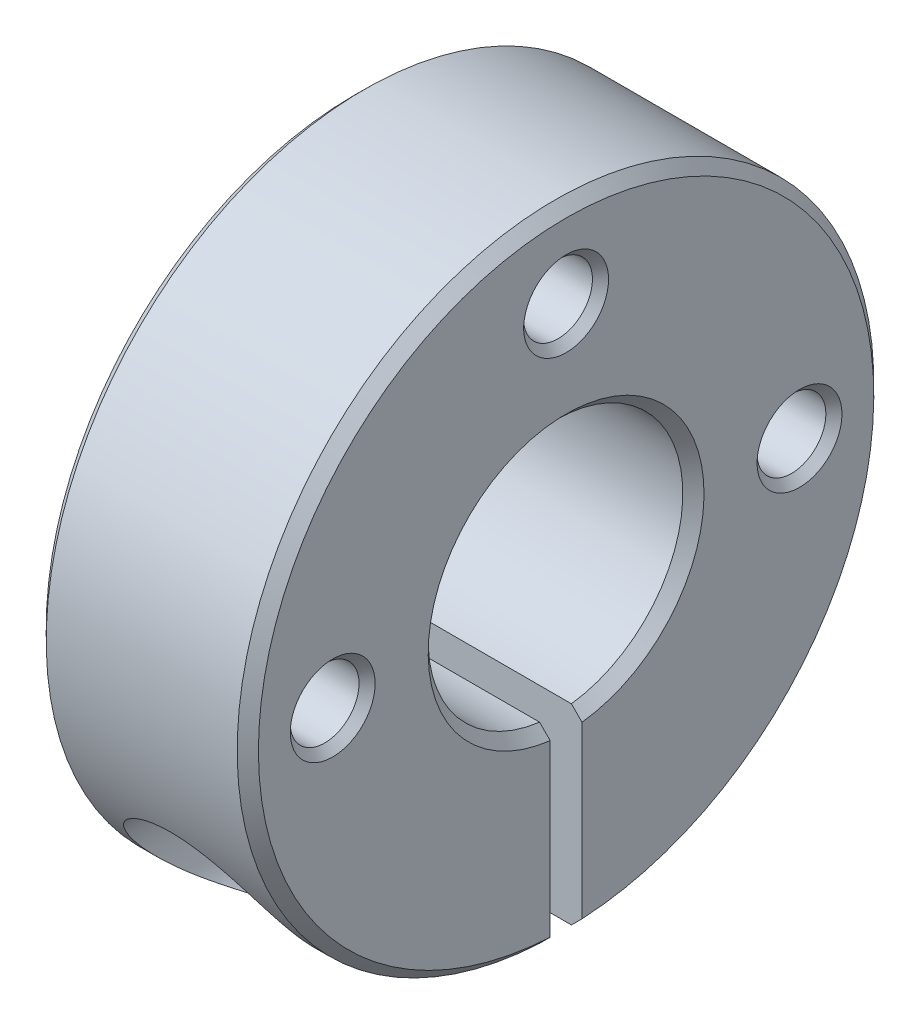
ISO-10303-21;
HEADER;
FILE_DESCRIPTION(('STEP AP214'),'2;1');
FILE_NAME('part.step','',(''),(''),'','','');
FILE_SCHEMA(('AUTOMOTIVE_DESIGN { 1 0 10303 214 1 1 1 1 }'));
ENDSEC;
DATA;
#1=APPLICATION_CONTEXT('core data for automotive mechanical design processes');
#2=APPLICATION_PROTOCOL_DEFINITION('international standard','automotive_design',2000,#1);
#3=PRODUCT_CONTEXT('',#1,'mechanical');
#4=PRODUCT('Part','Part','',(#3));
#5=PRODUCT_RELATED_PRODUCT_CATEGORY('part','',(#4));
#6=PRODUCT_DEFINITION_FORMATION('','',#4);
#7=PRODUCT_DEFINITION_CONTEXT('part definition',#1,'design');
#8=PRODUCT_DEFINITION('design','',#6,#7);
#9=PRODUCT_DEFINITION_SHAPE('','',#8);
#10=(LENGTH_UNIT() NAMED_UNIT(*) SI_UNIT(.MILLI.,.METRE.));
#11=(NAMED_UNIT(*) PLANE_ANGLE_UNIT() SI_UNIT($,.RADIAN.));
#12=(NAMED_UNIT(*) SI_UNIT($,.STERADIAN.) SOLID_ANGLE_UNIT());
#13=UNCERTAINTY_MEASURE_WITH_UNIT(LENGTH_MEASURE(1.E-05),#10,'distance_accuracy_value','');
#14=(GEOMETRIC_REPRESENTATION_CONTEXT(3) GLOBAL_UNCERTAINTY_ASSIGNED_CONTEXT((#13)) GLOBAL_UNIT_ASSIGNED_CONTEXT((#10,
#11,#12)) REPRESENTATION_CONTEXT('',''));
#15=CARTESIAN_POINT('',(0.,0.,0.));
#16=DIRECTION('',(0.,0.,1.));
#17=DIRECTION('',(1.,0.,0.));
#18=AXIS2_PLACEMENT_3D('',#15,#16,#17);
#19=CARTESIAN_POINT('',(0.,-13.,5.));
#20=DIRECTION('',(0.,0.,-1.));
#21=DIRECTION('',(-1.,0.,0.));
#22=AXIS2_PLACEMENT_3D('',#19,#20,#21);
#23=PLANE('',#22);
#24=CARTESIAN_POINT('',(0.,-10.,5.));
#25=DIRECTION('',(0.,0.,1.));
#26=DIRECTION('',(1.,0.,0.));
#27=AXIS2_PLACEMENT_3D('',#24,#25,#26);
#28=CIRCLE('',#27,3.75);
#29=CARTESIAN_POINT('',(3.75,-10.,5.));
#30=VERTEX_POINT('',#29);
#31=EDGE_CURVE('E203',#30,#30,#28,.T.);
#32=ORIENTED_EDGE('',*,*,#31,.T.);
#33=EDGE_LOOP('',(#32));
#34=FACE_BOUND('',#33,.T.);
#35=CARTESIAN_POINT('',(0.,-10.,5.));
#36=DIRECTION('',(0.,0.,1.));
#37=DIRECTION('',(1.,0.,0.));
#38=AXIS2_PLACEMENT_3D('',#35,#36,#37);
#39=CIRCLE('',#38,2.25);
#40=CARTESIAN_POINT('',(2.25,-10.,5.));
#41=VERTEX_POINT('',#40);
#42=EDGE_CURVE('E137',#41,#41,#39,.F.);
#43=ORIENTED_EDGE('',*,*,#42,.T.);
#44=EDGE_LOOP('',(#43));
#45=FACE_BOUND('',#44,.T.);
#46=ADVANCED_FACE('F17',(#34,#45),#23,.F.);
#47=CARTESIAN_POINT('',(4.99999999993861,0.,11.));
#48=DIRECTION('',(1.,0.,0.));
#49=DIRECTION('',(0.,0.,-1.));
#50=AXIS2_PLACEMENT_3D('',#47,#48,#49);
#51=CONICAL_SURFACE('',#50,1.9999999999286,0.785398163397448);
#52=CARTESIAN_POINT('',(4.99999999999545,0.,11.));
#53=DIRECTION('',(1.,0.,0.));
#54=DIRECTION('',(0.,0.,-1.));
#55=AXIS2_PLACEMENT_3D('',#52,#53,#54);
#56=CIRCLE('',#55,1.99999999998545);
#57=CARTESIAN_POINT('',(4.99999999999545,0.,9.00000000001455));
#58=VERTEX_POINT('',#57);
#59=EDGE_CURVE('E226',#58,#58,#56,.F.);
#60=ORIENTED_EDGE('',*,*,#59,.F.);
#61=EDGE_LOOP('',(#60));
#62=FACE_BOUND('',#61,.T.);
#63=CARTESIAN_POINT('',(4.621,0.,11.));
#64=DIRECTION('',(1.,0.,0.));
#65=DIRECTION('',(0.,0.,-1.));
#66=AXIS2_PLACEMENT_3D('',#63,#64,#65);
#67=CIRCLE('',#66,1.621);
#68=CARTESIAN_POINT('',(4.621,0.,9.379));
#69=VERTEX_POINT('',#68);
#70=EDGE_CURVE('E144',#69,#69,#67,.F.);
#71=ORIENTED_EDGE('',*,*,#70,.T.);
#72=EDGE_LOOP('',(#71));
#73=FACE_BOUND('',#72,.T.);
#74=ADVANCED_FACE('F320',(#62,#73),#51,.F.);
#75=CARTESIAN_POINT('',(5.0000000000523,0.,-11.));
#76=DIRECTION('',(1.,0.,0.));
#77=DIRECTION('',(0.,0.,-1.));
#78=AXIS2_PLACEMENT_3D('',#75,#76,#77);
#79=CONICAL_SURFACE('',#78,2.00000000003365,0.785398163397448);
#80=CARTESIAN_POINT('',(5.0000000000523,0.,-11.));
#81=DIRECTION('',(1.,0.,0.));
#82=DIRECTION('',(0.,0.,-1.));
#83=AXIS2_PLACEMENT_3D('',#80,#81,#82);
#84=CIRCLE('',#83,2.00000000003365);
#85=CARTESIAN_POINT('',(5.0000000000523,0.,-13.0000000000337));
#86=VERTEX_POINT('',#85);
#87=EDGE_CURVE('E229',#86,#86,#84,.F.);
#88=ORIENTED_EDGE('',*,*,#87,.F.);
#89=EDGE_LOOP('',(#88));
#90=FACE_BOUND('',#89,.T.);
#91=CARTESIAN_POINT('',(4.621,0.,-11.));
#92=DIRECTION('',(1.,0.,0.));
#93=DIRECTION('',(0.,0.,-1.));
#94=AXIS2_PLACEMENT_3D('',#91,#92,#93);
#95=CIRCLE('',#94,1.621);
#96=CARTESIAN_POINT('',(4.621,0.,-12.621));
#97=VERTEX_POINT('',#96);
#98=EDGE_CURVE('E141',#97,#97,#95,.F.);
#99=ORIENTED_EDGE('',*,*,#98,.T.);
#100=EDGE_LOOP('',(#99));
#101=FACE_BOUND('',#100,.T.);
#102=ADVANCED_FACE('F317',(#90,#101),#79,.F.);
#103=CARTESIAN_POINT('',(5.0000000000523,11.,0.));
#104=DIRECTION('',(1.,0.,0.));
#105=DIRECTION('',(0.,0.,-1.));
#106=AXIS2_PLACEMENT_3D('',#103,#104,#105);
#107=CONICAL_SURFACE('',#106,2.00000000003365,0.785398163397448);
#108=CARTESIAN_POINT('',(5.0000000000523,11.,0.));
#109=DIRECTION('',(1.,0.,0.));
#110=DIRECTION('',(0.,0.,-1.));
#111=AXIS2_PLACEMENT_3D('',#108,#109,#110);
#112=CIRCLE('',#111,2.00000000003365);
#113=CARTESIAN_POINT('',(5.0000000000523,11.,-2.00000000003365));
#114=VERTEX_POINT('',#113);
#115=EDGE_CURVE('E232',#114,#114,#112,.F.);
#116=ORIENTED_EDGE('',*,*,#115,.F.);
#117=EDGE_LOOP('',(#116));
#118=FACE_BOUND('',#117,.T.);
#119=CARTESIAN_POINT('',(4.621,11.,0.));
#120=DIRECTION('',(1.,0.,0.));
#121=DIRECTION('',(0.,0.,-1.));
#122=AXIS2_PLACEMENT_3D('',#119,#120,#121);
#123=CIRCLE('',#122,1.621);
#124=CARTESIAN_POINT('',(4.621,11.,-1.621));
#125=VERTEX_POINT('',#124);
#126=EDGE_CURVE('E138',#125,#125,#123,.F.);
#127=ORIENTED_EDGE('',*,*,#126,.T.);
#128=EDGE_LOOP('',(#127));
#129=FACE_BOUND('',#128,.T.);
#130=ADVANCED_FACE('F319',(#118,#129),#107,.F.);
#131=CARTESIAN_POINT('',(4.99999999988177,0.,0.));
#132=DIRECTION('',(1.,0.,0.));
#133=DIRECTION('',(0.,0.,-1.));
#134=AXIS2_PLACEMENT_3D('',#131,#132,#133);
#135=CONICAL_SURFACE('',#134,6.49999999995998,0.785398163454292);
#136=CARTESIAN_POINT('',(4.99999999993861,0.,0.));
#137=DIRECTION('',(1.,0.,0.));
#138=DIRECTION('',(0.,0.,-1.));
#139=AXIS2_PLACEMENT_3D('',#136,#137,#138);
#140=CIRCLE('',#139,6.50000000001683);
#141=CARTESIAN_POINT('',(4.99999999994863,-6.4565857850995,0.75));
#142=VERTEX_POINT('',#141);
#143=CARTESIAN_POINT('',(4.99999999994863,-6.4565857850995,-0.75));
#144=VERTEX_POINT('',#143);
#145=EDGE_CURVE('E93',#142,#144,#140,.F.);
#146=ORIENTED_EDGE('',*,*,#145,.F.);
#147=CARTESIAN_POINT('',(4.49999999999814,-5.952940449915,0.75));
#148=CARTESIAN_POINT('',(4.58330876539366,-6.03690572936784,0.75));
#149=CARTESIAN_POINT('',(4.6666298147905,-6.12085881372975,0.75));
#150=CARTESIAN_POINT('',(4.83329648144404,-6.2887405921279,0.75));
#151=CARTESIAN_POINT('',(4.9166420987007,-6.37266928616418,0.75));
#152=CARTESIAN_POINT('',(4.99999999995864,-6.45658578510958,0.75));
#153=B_SPLINE_CURVE_WITH_KNOTS('',3,(#147,#148,#149,#150,#151,#152),.UNSPECIFIED.,.F.,.F.,(4,2,
4),(0.,0.354844555852587,0.709689111097226),.UNSPECIFIED.);
#154=CARTESIAN_POINT('',(4.49999999999907,-5.95294044990516,0.75));
#155=VERTEX_POINT('',#154);
#156=EDGE_CURVE('E88',#155,#142,#153,.T.);
#157=ORIENTED_EDGE('',*,*,#156,.F.);
#158=CARTESIAN_POINT('',(4.5,0.,0.));
#159=DIRECTION('',(1.,0.,0.));
#160=DIRECTION('',(0.,0.,-1.));
#161=AXIS2_PLACEMENT_3D('',#158,#159,#160);
#162=CIRCLE('',#161,6.);
#163=CARTESIAN_POINT('',(4.49999999999907,-5.95294044990516,-0.75));
#164=VERTEX_POINT('',#163);
#165=EDGE_CURVE('E85',#155,#164,#162,.F.);
#166=ORIENTED_EDGE('',*,*,#165,.T.);
#167=CARTESIAN_POINT('',(4.99999999996804,-6.45658578510025,-0.749999999985619));
#168=CARTESIAN_POINT('',(4.91664209870541,-6.37266928615952,-0.74999999999281));
#169=CARTESIAN_POINT('',(4.83329648144561,-6.28874059212635,-0.749999999997603));
#170=CARTESIAN_POINT('',(4.66662981478894,-6.12085881373131,-0.750000000002397));
#171=CARTESIAN_POINT('',(4.5833087653921,-6.03690572936939,-0.750000000002397));
#172=CARTESIAN_POINT('',(4.49999999999814,-5.952940449915,-0.75));
#173=B_SPLINE_CURVE_WITH_KNOTS('',3,(#167,#168,#169,#170,#171,#172),.UNSPECIFIED.,.F.,.F.,(4,2,
4),(0.,0.354844555244643,0.709689111097231),.UNSPECIFIED.);
#174=EDGE_CURVE('E20',#144,#164,#173,.T.);
#175=ORIENTED_EDGE('',*,*,#174,.F.);
#176=EDGE_LOOP('',(#146,#157,#166,#175));
#177=FACE_BOUND('',#176,.T.);
#178=ADVANCED_FACE('F86',(#177),#135,.F.);
#179=CARTESIAN_POINT('',(0.,-10.,10.));
#180=DIRECTION('',(0.,0.,1.));
#181=DIRECTION('',(1.,0.,0.));
#182=AXIS2_PLACEMENT_3D('',#179,#180,#181);
#183=CYLINDRICAL_SURFACE('',#182,3.75);
#184=CARTESIAN_POINT('',(0.,-6.25,13.6358901432946));
#185=CARTESIAN_POINT('',(0.0970242423056597,-6.24999981087394,13.6358901685566));
#186=CARTESIAN_POINT('',(0.194045780381205,-6.25376881452274,13.6341645831621));
#187=CARTESIAN_POINT('',(0.38741803102158,-6.26880516866636,13.6272576254681));
#188=CARTESIAN_POINT('',(0.48376849242132,-6.28007518865302,13.6220750228698));
#189=CARTESIAN_POINT('',(0.67517148935047,-6.31000860873123,13.6082351107584));
#190=CARTESIAN_POINT('',(0.770222451712223,-6.32868026859605,13.599573919212));
#191=CARTESIAN_POINT('',(0.958269638065842,-6.37321620390483,13.5787598413948));
#192=CARTESIAN_POINT('',(1.05126507454301,-6.39908318618032,13.5666056410206));
#193=CARTESIAN_POINT('',(1.23434337921111,-6.45766866966609,13.5388169110311));
#194=CARTESIAN_POINT('',(1.32443145479969,-6.49037403453781,13.5231890506407));
#195=CARTESIAN_POINT('',(1.50128158057215,-6.56229943976615,13.4884328031672));
#196=CARTESIAN_POINT('',(1.58804239445232,-6.60152187333586,13.4693031298769));
#197=CARTESIAN_POINT('',(1.8423395571088,-6.72829608835693,13.4066746586185));
#198=CARTESIAN_POINT('',(2.00414285877426,-6.82503660400682,13.3578986790897));
#199=CARTESIAN_POINT('',(2.31119434997481,-7.04080657720774,13.2454544151428));
#200=CARTESIAN_POINT('',(2.45606550252834,-7.16022793785722,13.1815184471122));
#201=CARTESIAN_POINT('',(2.72307689611131,-7.41515373225647,13.0398135032126));
#202=CARTESIAN_POINT('',(2.84521206265397,-7.55066174538981,12.9620414467983));
#203=CARTESIAN_POINT('',(3.07353831663397,-7.84297652919568,12.7874447521504));
#204=CARTESIAN_POINT('',(3.17790489707762,-8.00061641164607,12.6896415137024));
#205=CARTESIAN_POINT('',(3.35910681456496,-8.32277129942031,12.4807183092839));
#206=CARTESIAN_POINT('',(3.43592595170953,-8.48729028687288,12.3695905586154));
#207=CARTESIAN_POINT('',(3.54393421590772,-8.76781756337541,12.1714966343027));
#208=CARTESIAN_POINT('',(3.58189556627709,-8.88336976284143,12.0874546116398));
#209=CARTESIAN_POINT('',(3.64583015454596,-9.11413656613081,11.9144154389576));
#210=CARTESIAN_POINT('',(3.67179978346272,-9.2293510579663,11.8254168062346));
#211=CARTESIAN_POINT('',(3.71251668441308,-9.45844837161211,11.642990735397));
#212=CARTESIAN_POINT('',(3.72725004478072,-9.57232937129954,11.5495579588096));
#213=CARTESIAN_POINT('',(3.74625367496716,-9.79779591637636,11.3589174672505));
#214=CARTESIAN_POINT('',(3.75052134138152,-9.90938088377009,11.2617088191158));
#215=CARTESIAN_POINT('',(3.74919255869156,-10.1651740870675,11.0321134842109));
#216=CARTESIAN_POINT('',(3.73996387072386,-10.308275313182,10.8985079160662));
#217=CARTESIAN_POINT('',(3.70626230495674,-10.5882266390394,10.6267378708188));
#218=CARTESIAN_POINT('',(3.68178423895619,-10.7250745942557,10.4885718573012));
#219=CARTESIAN_POINT('',(3.61901033835449,-10.9920155581833,10.2084809622448));
#220=CARTESIAN_POINT('',(3.58069171094715,-11.122097017117,10.0665502402757));
#221=CARTESIAN_POINT('',(3.4914704331778,-11.3748055855791,9.78009615864779));
#222=CARTESIAN_POINT('',(3.44056917734008,-11.4974335193016,9.63557308794227));
#223=CARTESIAN_POINT('',(3.32568588371165,-11.7379649852417,9.34115683111587));
#224=CARTESIAN_POINT('',(3.26140799214609,-11.8556730971188,9.19121983367847));
#225=CARTESIAN_POINT('',(3.12123865506923,-12.0828319211994,8.89048300340786));
#226=CARTESIAN_POINT('',(3.04534505363536,-12.1922810948687,8.73968301541199));
#227=CARTESIAN_POINT('',(2.8824033108562,-12.4024767241299,8.43873041710798));
#228=CARTESIAN_POINT('',(2.79538418987179,-12.5032447183707,8.28857713744431));
#229=CARTESIAN_POINT('',(2.60982125311552,-12.6961546806743,7.98994460003922));
#230=CARTESIAN_POINT('',(2.51128269167653,-12.7883005472615,7.84146461268622));
#231=CARTESIAN_POINT('',(2.30879474349376,-12.9577361591301,7.55794203682424));
#232=CARTESIAN_POINT('',(2.20565811203033,-13.0356086662027,7.42266842745655));
#233=CARTESIAN_POINT('',(1.98679878135862,-13.1831778224229,7.15729161450293));
#234=CARTESIAN_POINT('',(1.87105471907462,-13.2528601648001,7.02719771349728));
#235=CARTESIAN_POINT('',(1.68562956583738,-13.3505329929295,6.83874133291023));
#236=CARTESIAN_POINT('',(1.62150445624568,-13.3820882412685,6.7767455291474));
#237=CARTESIAN_POINT('',(1.48892369002677,-13.4425170041572,6.65607075865347));
#238=CARTESIAN_POINT('',(1.42046645013547,-13.4713895286249,6.597393019585));
#239=CARTESIAN_POINT('',(1.27894138793859,-13.5259812189286,6.48473114881268));
#240=CARTESIAN_POINT('',(1.20588839253388,-13.5517098095494,6.43073313733223));
#241=CARTESIAN_POINT('',(1.05450399057615,-13.5995576506684,6.3289171446733));
#242=CARTESIAN_POINT('',(0.976176712708288,-13.6216796790054,6.28109441314408));
#243=CARTESIAN_POINT('',(0.809152343221563,-13.6627299503063,6.1913150788414));
#244=CARTESIAN_POINT('',(0.720117721073378,-13.6814004056388,6.1498558813029));
#245=CARTESIAN_POINT('',(0.536158244459669,-13.712635776176,6.07989397393289));
#246=CARTESIAN_POINT('',(0.441251349012061,-13.7252183607353,6.05135378387201));
#247=CARTESIAN_POINT('',(0.28789793663465,-13.7393632554175,6.01914119378948));
#248=CARTESIAN_POINT('',(0.230787327884453,-13.7433334883943,6.01006085930473));
#249=CARTESIAN_POINT('',(0.115795504140579,-13.7486542546862,5.99787859611767));
#250=CARTESIAN_POINT('',(0.0579141413866268,-13.750004278187,5.9947778308615));
#251=CARTESIAN_POINT('',(-0.0963608163521987,-13.7499928817111,5.99480866041621));
#252=CARTESIAN_POINT('',(-0.192812377667967,-13.7462364899691,6.00344417136662));
#253=CARTESIAN_POINT('',(-0.382399142920902,-13.7316731098281,6.03667559107558));
#254=CARTESIAN_POINT('',(-0.475526833172583,-13.7208510975767,6.0613055086468));
#255=CARTESIAN_POINT('',(-0.68453952470638,-13.6889439743751,6.13308791506379));
#256=CARTESIAN_POINT('',(-0.798469315807616,-13.6657112221438,6.18486785867497));
#257=CARTESIAN_POINT('',(-1.01619836315319,-13.6114435543785,6.30339972492876));
#258=CARTESIAN_POINT('',(-1.11996932356801,-13.5803876617717,6.37019184869524));
#259=CARTESIAN_POINT('',(-1.31055263933914,-13.5148665126445,6.50797708993888));
#260=CARTESIAN_POINT('',(-1.3980557540254,-13.480849664246,6.57824761321757));
#261=CARTESIAN_POINT('',(-1.56625929769361,-13.4084780468281,6.72453612940164));
#262=CARTESIAN_POINT('',(-1.64695368854003,-13.3701194966149,6.80055911273549));
#263=CARTESIAN_POINT('',(-1.80252650278755,-13.2895416379444,6.956710537791));
#264=CARTESIAN_POINT('',(-1.87739296105425,-13.2473147551111,7.03684689279083));
#265=CARTESIAN_POINT('',(-2.02185604854402,-13.1593893244297,7.19993573797866));
#266=CARTESIAN_POINT('',(-2.09145086311522,-13.1136895918731,7.28288918378704));
#267=CARTESIAN_POINT('',(-2.28558711990389,-12.9770342848938,7.52526273422064));
#268=CARTESIAN_POINT('',(-2.40407590358312,-12.8819103536194,7.68720716663261));
#269=CARTESIAN_POINT('',(-2.62637835341112,-12.6808704178092,8.01452010750347));
#270=CARTESIAN_POINT('',(-2.73018084734537,-12.5749463015891,8.17989111416944));
#271=CARTESIAN_POINT('',(-2.92400729535211,-12.3525435731348,8.51203054308745));
#272=CARTESIAN_POINT('',(-3.01401138443728,-12.2360501214244,8.67880062215166));
#273=CARTESIAN_POINT('',(-3.18001547420803,-11.9929014367549,9.01181571495849));
#274=CARTESIAN_POINT('',(-3.25601953966562,-11.8662491686887,9.17806086728709));
#275=CARTESIAN_POINT('',(-3.3957191314628,-11.5984871845153,9.5143493339418));
#276=CARTESIAN_POINT('',(-3.45890816792349,-11.4570322787682,9.68432954673386));
#277=CARTESIAN_POINT('',(-3.56827433885402,-11.1637893512156,10.0209598138108));
#278=CARTESIAN_POINT('',(-3.6144467752439,-11.0119984894599,10.187608936429));
#279=CARTESIAN_POINT('',(-3.68770791621324,-10.699298417949,10.5155209499938));
#280=CARTESIAN_POINT('',(-3.71485646581374,-10.5384195386944,10.6767991976843));
#281=CARTESIAN_POINT('',(-3.74787509651916,-10.2083318852773,10.9928179079574));
#282=CARTESIAN_POINT('',(-3.7537612471265,-10.0391294998567,11.1475632204837));
#283=CARTESIAN_POINT('',(-3.74389500984593,-9.76165761737535,11.3898886948356));
#284=CARTESIAN_POINT('',(-3.7356924325381,-9.65538527329019,11.4801074375976));
#285=CARTESIAN_POINT('',(-3.70968376638943,-9.44108096419613,11.6569835043462));
#286=CARTESIAN_POINT('',(-3.69188050825661,-9.33304952694687,11.7436418699893));
#287=CARTESIAN_POINT('',(-3.64602244809316,-9.11608612942802,11.9128454757542));
#288=CARTESIAN_POINT('',(-3.61797666188741,-9.00715504322936,11.9953942608762));
#289=CARTESIAN_POINT('',(-3.55100285323596,-8.78927224090389,12.1559447480411));
#290=CARTESIAN_POINT('',(-3.51207621784139,-8.68032052917425,12.2339470281252));
#291=CARTESIAN_POINT('',(-3.42989504799869,-8.48077477666417,12.3729065332864));
#292=CARTESIAN_POINT('',(-3.38830608073857,-8.39000977954276,12.4346050362996));
#293=CARTESIAN_POINT('',(-3.29681957679899,-8.21012331942227,12.5541040359827));
#294=CARTESIAN_POINT('',(-3.24692357690825,-8.12100155580848,12.6119052508715));
#295=CARTESIAN_POINT('',(-3.13867401805688,-7.94527967498236,12.7233391216251));
#296=CARTESIAN_POINT('',(-3.08031882076252,-7.85868005015554,12.7769709668897));
#297=CARTESIAN_POINT('',(-2.95518450001538,-7.68905090256216,12.8797642545797));
#298=CARTESIAN_POINT('',(-2.88840959873552,-7.60601961819284,12.9289279165186));
#299=CARTESIAN_POINT('',(-2.74607110533981,-7.44396748052155,13.0229099522357));
#300=CARTESIAN_POINT('',(-2.67045017677625,-7.36497816952417,13.0676960835134));
#301=CARTESIAN_POINT('',(-2.5111518488236,-7.21275289095699,13.1523297961512));
#302=CARTESIAN_POINT('',(-2.42747818411361,-7.13951428468471,13.192179647422));
#303=CARTESIAN_POINT('',(-2.25252388463637,-6.99980481312927,13.2668387669563));
#304=CARTESIAN_POINT('',(-2.16124129297779,-6.93333569867482,13.3016467321888));
#305=CARTESIAN_POINT('',(-1.97177122724715,-6.80821341400376,13.3661208531525));
#306=CARTESIAN_POINT('',(-1.87358481340185,-6.74955904765628,13.3957877959817));
#307=CARTESIAN_POINT('',(-1.68291850082739,-6.64730069500083,13.4467940156324));
#308=CARTESIAN_POINT('',(-1.59110170951325,-6.60273979446193,13.4687004286469));
#309=CARTESIAN_POINT('',(-1.40340053694806,-6.52099986313274,13.5084650526231));
#310=CARTESIAN_POINT('',(-1.30751659470934,-6.48382003807023,13.5263236991913));
#311=CARTESIAN_POINT('',(-1.11258837366525,-6.41737076794055,13.5579757339739));
#312=CARTESIAN_POINT('',(-1.01354998807437,-6.38808744015088,13.57177626063));
#313=CARTESIAN_POINT('',(-0.812981941181344,-6.33772661819983,13.5953666983588));
#314=CARTESIAN_POINT('',(-0.711453301208579,-6.31664581783195,13.6051582254291));
#315=CARTESIAN_POINT('',(-0.508654415071605,-6.28326357187473,13.6206068417585));
#316=CARTESIAN_POINT('',(-0.407416165956894,-6.27080236544505,13.6263392162188));
#317=CARTESIAN_POINT('',(-0.204117600266998,-6.2541707815714,13.6339808063909));
#318=CARTESIAN_POINT('',(-0.102057304100016,-6.25000019893684,13.6358901167223));
#319=CARTESIAN_POINT('',(0.,-6.25,13.6358901432946));
#320=B_SPLINE_CURVE_WITH_KNOTS('',3,(#184,#185,#186,#187,#188,#189,#190,#191,#192,#193,#194,
#195,#196,#197,#198,#199,#200,#201,#202,#203,#204,#205,#206,#207,#208,#209,#210,#211,#212,#213,
#214,#215,#216,#217,#218,#219,#220,#221,#222,#223,#224,#225,#226,#227,#228,#229,#230,#231,#232,
#233,#234,#235,#236,#237,#238,#239,#240,#241,#242,#243,#244,#245,#246,#247,#248,#249,#250,#251,
#252,#253,#254,#255,#256,#257,#258,#259,#260,#261,#262,#263,#264,#265,#266,#267,#268,#269,#270,
#271,#272,#273,#274,#275,#276,#277,#278,#279,#280,#281,#282,#283,#284,#285,#286,#287,#288,#289,
#290,#291,#292,#293,#294,#295,#296,#297,#298,#299,#300,#301,#302,#303,#304,#305,#306,#307,#308,
#309,#310,#311,#312,#313,#314,#315,#316,#317,#318,#319),.UNSPECIFIED.,.T.,.F.,(4,2,2,2,2,2,2,2,
2,2,2,2,2,2,2,2,2,2,2,2,2,2,2,2,2,2,2,2,2,2,2,2,2,2,2,2,2,2,2,2,2,2,2,2,2,2,2,2,2,2,2,2,2,2,2,2,
2,2,2,2,2,2,2,2,2,2,2,4),(0.,0.290979751801275,0.582063114057779,0.873472225966735,
1.16499111261327,1.45595506167924,1.74702609630856,2.32837454583748,2.92087292563075,
3.51350338809633,4.14956643548925,4.78600292314236,5.22897315628102,5.67207661730145,
6.11572779970765,6.55948933182907,7.14661706697911,7.73394466612213,8.32224392667349,
8.91047801562107,9.51345411959783,10.1165422743922,10.7180882287439,11.3193608642575,
11.8800939395845,12.4417923999694,12.72547501653,13.0092619161592,13.2921760552284,
13.574871248631,13.8738708489617,14.1719973520468,14.3455498582986,14.5191361292946,
14.8079587619061,15.097397536139,15.4770598474849,15.8577512333222,16.2090478119943,
16.5606527241598,16.9129614430668,17.265390890815,17.930606611541,18.596325687882,
19.2629943496853,19.9294691445158,20.6186093771739,21.3079397309362,21.995091746197,
22.6817243231774,23.1003259164237,23.5188041547169,23.9369149184455,24.3549724072211,
24.7067258938286,25.0584143787244,25.4101710680611,25.7617520606469,26.1157533156193,
26.4695911767133,26.8235203215526,27.1773952313595,27.4901406070312,27.802852310135,
28.1150106007366,28.4270429385079,28.7331246282047,29.0391987423727),.UNSPECIFIED.);
#321=CARTESIAN_POINT('',(0.,-6.25,13.6358901432946));
#322=VERTEX_POINT('',#321);
#323=EDGE_CURVE('E92',#322,#322,#320,.T.);
#324=ORIENTED_EDGE('',*,*,#323,.F.);
#325=EDGE_LOOP('',(#324));
#326=FACE_BOUND('',#325,.T.);
#327=ORIENTED_EDGE('',*,*,#31,.F.);
#328=EDGE_LOOP('',(#327));
#329=FACE_BOUND('',#328,.T.);
#330=ADVANCED_FACE('F214',(#326,#329),#183,.F.);
#331=CARTESIAN_POINT('',(4.50000000000001,0.,0.));
#332=DIRECTION('',(-1.,0.,0.));
#333=DIRECTION('',(0.,0.,1.));
#334=AXIS2_PLACEMENT_3D('',#331,#332,#333);
#335=CONICAL_SURFACE('',#334,15.,0.785398163397447);
#336=CARTESIAN_POINT('',(4.99999999999999,-14.4805904575746,-0.75));
#337=CARTESIAN_POINT('',(4.91666850019184,-14.5640335902283,-0.75));
#338=CARTESIAN_POINT('',(4.83333608362101,-14.6474758073056,-0.75));
#339=CARTESIAN_POINT('',(4.66666941695435,-14.8143584103069,-0.75));
#340=CARTESIAN_POINT('',(4.58333516685852,-14.897798796231,-0.75));
#341=CARTESIAN_POINT('',(4.50000000000001,-14.9812382665786,-0.75));
#342=B_SPLINE_CURVE_WITH_KNOTS('',3,(#336,#337,#338,#339,#340,#341),.UNSPECIFIED.,.F.,.F.,(4,2,
4),(0.,0.353782499822632,0.707564999643815),.UNSPECIFIED.);
#343=CARTESIAN_POINT('',(5.,-14.4805904575746,-0.75));
#344=VERTEX_POINT('',#343);
#345=CARTESIAN_POINT('',(4.50000000000001,-14.9812382665786,-0.75));
#346=VERTEX_POINT('',#345);
#347=EDGE_CURVE('E146',#344,#346,#342,.T.);
#348=ORIENTED_EDGE('',*,*,#347,.T.);
#349=CARTESIAN_POINT('',(4.5,0.,0.));
#350=DIRECTION('',(1.,0.,0.));
#351=DIRECTION('',(0.,0.,-1.));
#352=AXIS2_PLACEMENT_3D('',#349,#350,#351);
#353=CIRCLE('',#352,15.);
#354=CARTESIAN_POINT('',(4.50000000000001,-14.9812382665786,0.75));
#355=VERTEX_POINT('',#354);
#356=EDGE_CURVE('E120',#355,#346,#353,.F.);
#357=ORIENTED_EDGE('',*,*,#356,.F.);
#358=CARTESIAN_POINT('',(4.50000000000001,-14.9812382665786,0.75));
#359=CARTESIAN_POINT('',(4.58333516685852,-14.897798796231,0.75));
#360=CARTESIAN_POINT('',(4.66666941695435,-14.8143584103069,0.75));
#361=CARTESIAN_POINT('',(4.83333608362101,-14.6474758073056,0.75));
#362=CARTESIAN_POINT('',(4.91666850019184,-14.5640335902283,0.75));
#363=CARTESIAN_POINT('',(4.99999999999999,-14.4805904575746,0.75));
#364=B_SPLINE_CURVE_WITH_KNOTS('',3,(#358,#359,#360,#361,#362,#363),.UNSPECIFIED.,.F.,.F.,(4,2,
4),(0.,0.353782499821183,0.707564999643814),.UNSPECIFIED.);
#365=CARTESIAN_POINT('',(4.99999999999999,-14.4805904575746,0.75));
#366=VERTEX_POINT('',#365);
#367=EDGE_CURVE('E197',#355,#366,#364,.T.);
#368=ORIENTED_EDGE('',*,*,#367,.T.);
#369=CARTESIAN_POINT('',(4.99999999999999,0.,0.));
#370=DIRECTION('',(-1.,0.,0.));
#371=DIRECTION('',(0.,0.,1.));
#372=AXIS2_PLACEMENT_3D('',#369,#370,#371);
#373=CIRCLE('',#372,14.5);
#374=EDGE_CURVE('E235',#344,#366,#373,.F.);
#375=ORIENTED_EDGE('',*,*,#374,.F.);
#376=EDGE_LOOP('',(#348,#357,#368,#375));
#377=FACE_BOUND('',#376,.T.);
#378=ADVANCED_FACE('F208',(#377),#335,.T.);
#379=CARTESIAN_POINT('',(0.,-10.,-8.4395));
#380=DIRECTION('',(0.,0.,-1.));
#381=DIRECTION('',(-1.,0.,0.));
#382=AXIS2_PLACEMENT_3D('',#379,#380,#381);
#383=CYLINDRICAL_SURFACE('',#382,1.621);
#384=CARTESIAN_POINT('',(0.,-11.621,-9.48432174696747));
#385=CARTESIAN_POINT('',(0.0689915382779338,-11.6209949830226,-9.48432860323723));
#386=CARTESIAN_POINT('',(0.138017976350587,-11.6165475446014,-9.48978523429127));
#387=CARTESIAN_POINT('',(0.27341019938532,-11.5992402152367,-9.51093050612972));
#388=CARTESIAN_POINT('',(0.339771888031803,-11.5863678620479,-9.52663430455556));
#389=CARTESIAN_POINT('',(0.467245436964716,-11.5535823475253,-9.56636715126161));
#390=CARTESIAN_POINT('',(0.528403130384784,-11.5337408275942,-9.59031144048407));
#391=CARTESIAN_POINT('',(0.645394309023521,-11.4883054295702,-9.64469274869149));
#392=CARTESIAN_POINT('',(0.701225303036275,-11.4627088785499,-9.67513278429418));
#393=CARTESIAN_POINT('',(0.836830099030726,-11.3914213629962,-9.75909653450887));
#394=CARTESIAN_POINT('',(0.912738264324287,-11.3424528915175,-9.81606760934954));
#395=CARTESIAN_POINT('',(1.05200548313007,-11.2363736122115,-9.9373268853438));
#396=CARTESIAN_POINT('',(1.11532923153499,-11.1792406491284,-10.0016348970905));
#397=CARTESIAN_POINT('',(1.25524929286823,-11.0325988824972,-10.1635738768186));
#398=CARTESIAN_POINT('',(1.32567949123387,-10.9397998875208,-10.2635547477174));
#399=CARTESIAN_POINT('',(1.4442255757869,-10.7448929367482,-10.4674388922407));
#400=CARTESIAN_POINT('',(1.49232157556009,-10.6427767813454,-10.5713455727508));
#401=CARTESIAN_POINT('',(1.567358390707,-10.4291040628994,-10.7822454226118));
#402=CARTESIAN_POINT('',(1.59379277418583,-10.3173855289458,-10.8892550131766));
#403=CARTESIAN_POINT('',(1.62263550189025,-10.0890048880912,-11.1011799577063));
#404=CARTESIAN_POINT('',(1.62506086895136,-9.97234634269565,-11.2060967428279));
#405=CARTESIAN_POINT('',(1.60533499638208,-9.75312626507887,-11.3971368684047));
#406=CARTESIAN_POINT('',(1.5864845040277,-9.65080760842425,-11.4838742756359));
#407=CARTESIAN_POINT('',(1.52761089560371,-9.4475417373014,-11.6516622956977));
#408=CARTESIAN_POINT('',(1.48761119017019,-9.34659313276214,-11.7327190844216));
#409=CARTESIAN_POINT('',(1.39545494457161,-9.17049763288671,-11.87062794378));
#410=CARTESIAN_POINT('',(1.34753612644438,-9.09433940612529,-11.9290148035506));
#411=CARTESIAN_POINT('',(1.23681358229961,-8.94818756848634,-12.0390310170681));
#412=CARTESIAN_POINT('',(1.17402863728594,-8.87818633102643,-12.0906687705259));
#413=CARTESIAN_POINT('',(1.04542781659216,-8.75858932083838,-12.1775061383602));
#414=CARTESIAN_POINT('',(0.981853846210714,-8.7075362326223,-12.2140112911481));
#415=CARTESIAN_POINT('',(0.845135069735405,-8.61427865471555,-12.2799620291617));
#416=CARTESIAN_POINT('',(0.771988868454003,-8.57207545726681,-12.3094065835039));
#417=CARTESIAN_POINT('',(0.617088322332113,-8.49858520388393,-12.3602619367734));
#418=CARTESIAN_POINT('',(0.535276168654482,-8.46737835593628,-12.3816137890396));
#419=CARTESIAN_POINT('',(0.366028937520621,-8.41842619216924,-12.4149505827321));
#420=CARTESIAN_POINT('',(0.278609867204991,-8.40064425643362,-12.4269610080398));
#421=CARTESIAN_POINT('',(0.158598309812244,-8.38646299771169,-12.4365288481509));
#422=CARTESIAN_POINT('',(0.126977785820577,-8.38366872724692,-12.4384124139614));
#423=CARTESIAN_POINT('',(0.063576873943278,-8.37993622244347,-12.4409273904843));
#424=CARTESIAN_POINT('',(0.031796488319995,-8.37899796191235,-12.4415588188671));
#425=CARTESIAN_POINT('',(-0.0791113307582089,-8.37900507086897,-12.4415550560368));
#426=CARTESIAN_POINT('',(-0.158322343730792,-8.3848309710169,-12.437636896494));
#427=CARTESIAN_POINT('',(-0.31439407645791,-8.40781758851624,-12.4221087642712));
#428=CARTESIAN_POINT('',(-0.39124992695896,-8.42500032271118,-12.4104838508156));
#429=CARTESIAN_POINT('',(-0.540074952256559,-8.46964976734508,-12.3800546346248));
#430=CARTESIAN_POINT('',(-0.612061084867941,-8.49707836232219,-12.3612769358038));
#431=CARTESIAN_POINT('',(-0.749771805542278,-8.56081776857539,-12.3172193634016));
#432=CARTESIAN_POINT('',(-0.815497440396925,-8.59712709130695,-12.2919405794643));
#433=CARTESIAN_POINT('',(-0.942886174866048,-8.67915004283967,-12.234173138249));
#434=CARTESIAN_POINT('',(-1.00415248146534,-8.7252585173522,-12.2013746617143));
#435=CARTESIAN_POINT('',(-1.11787084321377,-8.8237047599547,-12.1303718415376));
#436=CARTESIAN_POINT('',(-1.17031963918333,-8.87604481924208,-12.0921655085814));
#437=CARTESIAN_POINT('',(-1.27365615183353,-8.99377355300379,-12.0049234810732));
#438=CARTESIAN_POINT('',(-1.32302955604028,-9.05992508653536,-11.9551278574258));
#439=CARTESIAN_POINT('',(-1.409928347114,-9.19608376581651,-11.8507147204636));
#440=CARTESIAN_POINT('',(-1.44744260018878,-9.26609446271159,-11.7960927371722));
#441=CARTESIAN_POINT('',(-1.52620506396581,-9.44187566859624,-11.6562768802018));
#442=CARTESIAN_POINT('',(-1.56080623491941,-9.54887777234476,-11.5688564423392));
#443=CARTESIAN_POINT('',(-1.60736396849722,-9.76318208830618,-11.3885899346808));
#444=CARTESIAN_POINT('',(-1.61929262578651,-9.87048450776921,-11.295737323589));
#445=CARTESIAN_POINT('',(-1.62238531962781,-10.0838017367256,-11.1057461910243));
#446=CARTESIAN_POINT('',(-1.61329388458185,-10.1897847982337,-11.0085691663689));
#447=CARTESIAN_POINT('',(-1.57513428686829,-10.3971477601344,-10.8129387518915));
#448=CARTESIAN_POINT('',(-1.54604048030539,-10.4985215731967,-10.7144838829772));
#449=CARTESIAN_POINT('',(-1.48454832506829,-10.6538755297853,-10.5594285990168));
#450=CARTESIAN_POINT('',(-1.45853783422795,-10.7100571854864,-10.5024233883959));
#451=CARTESIAN_POINT('',(-1.3997880541677,-10.8198242207442,-10.3893024049586));
#452=CARTESIAN_POINT('',(-1.36704615072313,-10.873408581589,-10.3331869868513));
#453=CARTESIAN_POINT('',(-1.29474629587077,-10.9773817858278,-10.2226627970862));
#454=CARTESIAN_POINT('',(-1.2552031213578,-11.0277772395472,-10.1682506216327));
#455=CARTESIAN_POINT('',(-1.16897526610766,-11.1248776680548,-10.0619219074648));
#456=CARTESIAN_POINT('',(-1.12229715340851,-11.171585977665,-10.0100031306474));
#457=CARTESIAN_POINT('',(-1.01845520799949,-11.2631128897666,-9.90693189230433));
#458=CARTESIAN_POINT('',(-0.960844636309123,-11.3076710295161,-9.8559927162079));
#459=CARTESIAN_POINT('',(-0.836632752761731,-11.3904095988077,-9.76025401554717));
#460=CARTESIAN_POINT('',(-0.770045151249189,-11.4285995591177,-9.71544533431635));
#461=CARTESIAN_POINT('',(-0.642280796960733,-11.4896468103736,-9.64312109936749));
#462=CARTESIAN_POINT('',(-0.582794287115223,-11.5140423486757,-9.61394359477122));
#463=CARTESIAN_POINT('',(-0.458440239225734,-11.5562010818673,-9.56322689674073));
#464=CARTESIAN_POINT('',(-0.393581477924712,-11.5739748434786,-9.54167553664446));
#465=CARTESIAN_POINT('',(-0.274000334190229,-11.5985805966129,-9.5117413172902));
#466=CARTESIAN_POINT('',(-0.220050137450196,-11.6069346093843,-9.50153393193254));
#467=CARTESIAN_POINT('',(-0.110740496309111,-11.6181454760136,-9.48782242981805));
#468=CARTESIAN_POINT('',(-0.0553814924055069,-11.6210040272721,-9.4843162432425));
#469=CARTESIAN_POINT('',(0.,-11.621,-9.48432174696747));
#470=B_SPLINE_CURVE_WITH_KNOTS('',3,(#384,#385,#386,#387,#388,#389,#390,#391,#392,#393,#394,
#395,#396,#397,#398,#399,#400,#401,#402,#403,#404,#405,#406,#407,#408,#409,#410,#411,#412,#413,
#414,#415,#416,#417,#418,#419,#420,#421,#422,#423,#424,#425,#426,#427,#428,#429,#430,#431,#432,
#433,#434,#435,#436,#437,#438,#439,#440,#441,#442,#443,#444,#445,#446,#447,#448,#449,#450,#451,
#452,#453,#454,#455,#456,#457,#458,#459,#460,#461,#462,#463,#464,#465,#466,#467,#468,#469),
.UNSPECIFIED.,.T.,.F.,(4,2,2,2,2,2,2,2,2,2,2,2,2,2,2,2,2,2,2,2,2,2,2,2,2,2,2,2,2,2,2,2,2,2,2,2,
2,2,2,2,2,2,4),(0.,0.206703086593064,0.413712624263467,0.618653595803653,0.823689949645895,
1.14228684237986,1.46176530598519,1.91988975679572,2.37842134403223,2.84738960759735,
3.31602534017672,3.72086413860243,4.12525574530385,4.44583538756992,4.76601216888966,
5.03292346370038,5.29987370522497,5.56873264194263,5.83685552000749,5.93219387114909,
6.02753087684459,6.26473434771752,6.50239902550492,6.73918823584073,6.97593778388353,
7.2251674420804,7.47448902041222,7.76262666634842,8.05103402823622,8.47604117587307,
8.90157108451839,9.33229989038411,9.763581941259,10.0157909676687,10.268098128128,
10.5198638784384,10.7713992472675,11.0373067623472,11.302812670937,11.5138762498483,
11.7246015659046,11.8905793539226,12.0565058676095),.UNSPECIFIED.);
#471=CARTESIAN_POINT('',(0.,-11.621,-9.48432174696747));
#472=VERTEX_POINT('',#471);
#473=EDGE_CURVE('E123',#472,#472,#470,.T.);
#474=ORIENTED_EDGE('',*,*,#473,.F.);
#475=EDGE_LOOP('',(#474));
#476=FACE_BOUND('',#475,.T.);
#477=CARTESIAN_POINT('',(0.,-10.,-1.12899999999172));
#478=DIRECTION('',(0.,0.,1.));
#479=DIRECTION('',(0.,1.,0.));
#480=AXIS2_PLACEMENT_3D('',#477,#478,#479);
#481=CIRCLE('',#480,1.62100000000919);
#482=CARTESIAN_POINT('',(0.,-8.37899999999081,-1.12899999999172));
#483=VERTEX_POINT('',#482);
#484=EDGE_CURVE('E134',#483,#483,#481,.T.);
#485=ORIENTED_EDGE('',*,*,#484,.T.);
#486=EDGE_LOOP('',(#485));
#487=FACE_BOUND('',#486,.T.);
#488=ADVANCED_FACE('F213',(#476,#487),#383,.F.);
#489=CARTESIAN_POINT('',(0.,0.,11.));
#490=DIRECTION('',(1.,0.,0.));
#491=DIRECTION('',(0.,0.,-1.));
#492=AXIS2_PLACEMENT_3D('',#489,#490,#491);
#493=CYLINDRICAL_SURFACE('',#492,1.621);
#494=CARTESIAN_POINT('',(-4.620999999986,0.,11.));
#495=DIRECTION('',(-1.,0.,0.));
#496=DIRECTION('',(0.,0.,-1.));
#497=AXIS2_PLACEMENT_3D('',#494,#495,#496);
#498=CIRCLE('',#497,1.62100000003284);
#499=CARTESIAN_POINT('',(-4.620999999986,0.,9.37899999996716));
#500=VERTEX_POINT('',#499);
#501=EDGE_CURVE('E131',#500,#500,#498,.T.);
#502=ORIENTED_EDGE('',*,*,#501,.T.);
#503=EDGE_LOOP('',(#502));
#504=FACE_BOUND('',#503,.T.);
#505=ORIENTED_EDGE('',*,*,#70,.F.);
#506=EDGE_LOOP('',(#505));
#507=FACE_BOUND('',#506,.T.);
#508=ADVANCED_FACE('F275',(#504,#507),#493,.F.);
#509=CARTESIAN_POINT('',(0.,0.,-11.));
#510=DIRECTION('',(1.,0.,0.));
#511=DIRECTION('',(0.,0.,-1.));
#512=AXIS2_PLACEMENT_3D('',#509,#510,#511);
#513=CYLINDRICAL_SURFACE('',#512,1.621);
#514=CARTESIAN_POINT('',(-4.62100000004284,0.,-11.));
#515=DIRECTION('',(-1.,0.,0.));
#516=DIRECTION('',(0.,0.,-1.));
#517=AXIS2_PLACEMENT_3D('',#514,#515,#516);
#518=CIRCLE('',#517,1.6210000000242);
#519=CARTESIAN_POINT('',(-4.62100000004284,0.,-12.6210000000242));
#520=VERTEX_POINT('',#519);
#521=EDGE_CURVE('E128',#520,#520,#518,.T.);
#522=ORIENTED_EDGE('',*,*,#521,.T.);
#523=EDGE_LOOP('',(#522));
#524=FACE_BOUND('',#523,.T.);
#525=ORIENTED_EDGE('',*,*,#98,.F.);
#526=EDGE_LOOP('',(#525));
#527=FACE_BOUND('',#526,.T.);
#528=ADVANCED_FACE('F272',(#524,#527),#513,.F.);
#529=CARTESIAN_POINT('',(0.,11.,0.));
#530=DIRECTION('',(1.,0.,0.));
#531=DIRECTION('',(0.,0.,-1.));
#532=AXIS2_PLACEMENT_3D('',#529,#530,#531);
#533=CYLINDRICAL_SURFACE('',#532,1.621);
#534=CARTESIAN_POINT('',(-4.62100000004284,11.,0.));
#535=DIRECTION('',(-1.,0.,0.));
#536=DIRECTION('',(0.,1.,0.));
#537=AXIS2_PLACEMENT_3D('',#534,#535,#536);
#538=CIRCLE('',#537,1.6210000000242);
#539=CARTESIAN_POINT('',(-4.62100000004284,12.6210000000242,0.));
#540=VERTEX_POINT('',#539);
#541=EDGE_CURVE('E114',#540,#540,#538,.T.);
#542=ORIENTED_EDGE('',*,*,#541,.T.);
#543=EDGE_LOOP('',(#542));
#544=FACE_BOUND('',#543,.T.);
#545=ORIENTED_EDGE('',*,*,#126,.F.);
#546=EDGE_LOOP('',(#545));
#547=FACE_BOUND('',#546,.T.);
#548=ADVANCED_FACE('F268',(#544,#547),#533,.F.);
#549=CARTESIAN_POINT('',(0.,-10.,-0.750000000039108));
#550=DIRECTION('',(0.,0.,1.));
#551=DIRECTION('',(1.,0.,0.));
#552=AXIS2_PLACEMENT_3D('',#549,#550,#551);
#553=CONICAL_SURFACE('',#552,1.9999999999618,0.785398163397448);
#554=ORIENTED_EDGE('',*,*,#484,.F.);
#555=EDGE_LOOP('',(#554));
#556=FACE_BOUND('',#555,.T.);
#557=CARTESIAN_POINT('',(0.,-10.,-0.750000000039108));
#558=DIRECTION('',(0.,0.,1.));
#559=DIRECTION('',(1.,0.,0.));
#560=AXIS2_PLACEMENT_3D('',#557,#558,#559);
#561=CIRCLE('',#560,1.9999999999618);
#562=CARTESIAN_POINT('',(1.9999999999618,-10.,-0.750000000039108));
#563=VERTEX_POINT('',#562);
#564=EDGE_CURVE('E109',#563,#563,#561,.T.);
#565=ORIENTED_EDGE('',*,*,#564,.T.);
#566=EDGE_LOOP('',(#565));
#567=FACE_BOUND('',#566,.T.);
#568=ADVANCED_FACE('F264',(#556,#567),#553,.F.);
#569=CARTESIAN_POINT('',(0.,-10.,2.5));
#570=DIRECTION('',(0.,0.,1.));
#571=DIRECTION('',(1.,0.,0.));
#572=AXIS2_PLACEMENT_3D('',#569,#570,#571);
#573=CYLINDRICAL_SURFACE('',#572,2.25);
#574=CARTESIAN_POINT('',(0.,-10.,0.75));
#575=DIRECTION('',(0.,0.,1.));
#576=DIRECTION('',(1.,0.,0.));
#577=AXIS2_PLACEMENT_3D('',#574,#575,#576);
#578=CIRCLE('',#577,2.25);
#579=CARTESIAN_POINT('',(2.25,-10.,0.75));
#580=VERTEX_POINT('',#579);
#581=EDGE_CURVE('E443',#580,#580,#578,.F.);
#582=ORIENTED_EDGE('',*,*,#581,.T.);
#583=EDGE_LOOP('',(#582));
#584=FACE_BOUND('',#583,.T.);
#585=ORIENTED_EDGE('',*,*,#42,.F.);
#586=EDGE_LOOP('',(#585));
#587=FACE_BOUND('',#586,.T.);
#588=ADVANCED_FACE('F260',(#584,#587),#573,.F.);
#589=CARTESIAN_POINT('',(5.,10.5,0.));
#590=DIRECTION('',(1.,0.,0.));
#591=DIRECTION('',(0.,0.,-1.));
#592=AXIS2_PLACEMENT_3D('',#589,#590,#591);
#593=PLANE('',#592);
#594=DIRECTION('',(0.,1.,0.));
#595=VECTOR('',#594,1.);
#596=CARTESIAN_POINT('',(5.,0.,0.75));
#597=LINE('',#596,#595);
#598=EDGE_CURVE('E118',#366,#142,#597,.T.);
#599=ORIENTED_EDGE('',*,*,#598,.T.);
#600=ORIENTED_EDGE('',*,*,#145,.T.);
#601=DIRECTION('',(0.,1.,0.));
#602=VECTOR('',#601,1.);
#603=CARTESIAN_POINT('',(5.,-15.,-0.75));
#604=LINE('',#603,#602);
#605=EDGE_CURVE('E105',#144,#344,#604,.F.);
#606=ORIENTED_EDGE('',*,*,#605,.T.);
#607=ORIENTED_EDGE('',*,*,#374,.T.);
#608=EDGE_LOOP('',(#599,#600,#606,#607));
#609=FACE_BOUND('',#608,.T.);
#610=ORIENTED_EDGE('',*,*,#115,.T.);
#611=EDGE_LOOP('',(#610));
#612=FACE_BOUND('',#611,.T.);
#613=ORIENTED_EDGE('',*,*,#87,.T.);
#614=EDGE_LOOP('',(#613));
#615=FACE_BOUND('',#614,.T.);
#616=ORIENTED_EDGE('',*,*,#59,.T.);
#617=EDGE_LOOP('',(#616));
#618=FACE_BOUND('',#617,.T.);
#619=ADVANCED_FACE('F257',(#609,#612,#615,#618),#593,.T.);
#620=CARTESIAN_POINT('',(0.,0.,0.));
#621=DIRECTION('',(1.,0.,0.));
#622=DIRECTION('',(0.,0.,-1.));
#623=AXIS2_PLACEMENT_3D('',#620,#621,#622);
#624=CYLINDRICAL_SURFACE('',#623,6.);
#625=ORIENTED_EDGE('',*,*,#165,.F.);
#626=DIRECTION('',(1.,0.,0.));
#627=VECTOR('',#626,1.);
#628=CARTESIAN_POINT('',(5.,-5.95294044989533,0.75));
#629=LINE('',#628,#627);
#630=CARTESIAN_POINT('',(-4.49999999999295,-5.95294044990977,0.75));
#631=VERTEX_POINT('',#630);
#632=EDGE_CURVE('E446',#155,#631,#629,.F.);
#633=ORIENTED_EDGE('',*,*,#632,.T.);
#634=CARTESIAN_POINT('',(-4.50000000000728,0.,0.));
#635=DIRECTION('',(-1.,0.,0.));
#636=DIRECTION('',(0.,1.,0.));
#637=AXIS2_PLACEMENT_3D('',#634,#635,#636);
#638=CIRCLE('',#637,6.00000000002865);
#639=CARTESIAN_POINT('',(-4.49999999999295,-5.95294044990977,-0.75));
#640=VERTEX_POINT('',#639);
#641=EDGE_CURVE('E108',#631,#640,#638,.T.);
#642=ORIENTED_EDGE('',*,*,#641,.T.);
#643=DIRECTION('',(-1.,0.,0.));
#644=VECTOR('',#643,1.);
#645=CARTESIAN_POINT('',(5.,-5.95294044989533,-0.75));
#646=LINE('',#645,#644);
#647=EDGE_CURVE('E101',#640,#164,#646,.F.);
#648=ORIENTED_EDGE('',*,*,#647,.T.);
#649=EDGE_LOOP('',(#625,#633,#642,#648));
#650=FACE_BOUND('',#649,.T.);
#651=ADVANCED_FACE('F106',(#650),#624,.F.);
#652=CARTESIAN_POINT('',(0.,0.,0.));
#653=DIRECTION('',(1.,0.,0.));
#654=DIRECTION('',(0.,0.,-1.));
#655=AXIS2_PLACEMENT_3D('',#652,#653,#654);
#656=CYLINDRICAL_SURFACE('',#655,15.);
#657=ORIENTED_EDGE('',*,*,#473,.T.);
#658=EDGE_LOOP('',(#657));
#659=FACE_BOUND('',#658,.T.);
#660=DIRECTION('',(-1.,0.,0.));
#661=VECTOR('',#660,1.);
#662=CARTESIAN_POINT('',(5.,-14.9812382665786,-0.75));
#663=LINE('',#662,#661);
#664=CARTESIAN_POINT('',(-4.50000000000002,-14.9812382665786,-0.75));
#665=VERTEX_POINT('',#664);
#666=EDGE_CURVE('E111',#346,#665,#663,.T.);
#667=ORIENTED_EDGE('',*,*,#666,.T.);
#668=CARTESIAN_POINT('',(-4.5,0.,0.));
#669=DIRECTION('',(1.,0.,0.));
#670=DIRECTION('',(0.,1.,0.));
#671=AXIS2_PLACEMENT_3D('',#668,#669,#670);
#672=CIRCLE('',#671,15.);
#673=CARTESIAN_POINT('',(-4.50000000000002,-14.9812382665786,0.75));
#674=VERTEX_POINT('',#673);
#675=EDGE_CURVE('E167',#674,#665,#672,.F.);
#676=ORIENTED_EDGE('',*,*,#675,.F.);
#677=DIRECTION('',(1.,0.,0.));
#678=VECTOR('',#677,1.);
#679=CARTESIAN_POINT('',(5.,-14.9812382665786,0.75));
#680=LINE('',#679,#678);
#681=EDGE_CURVE('E449',#674,#355,#680,.T.);
#682=ORIENTED_EDGE('',*,*,#681,.T.);
#683=ORIENTED_EDGE('',*,*,#356,.T.);
#684=EDGE_LOOP('',(#667,#676,#682,#683));
#685=FACE_BOUND('',#684,.T.);
#686=ORIENTED_EDGE('',*,*,#323,.T.);
#687=EDGE_LOOP('',(#686));
#688=FACE_BOUND('',#687,.T.);
#689=ADVANCED_FACE('F246',(#659,#685,#688),#656,.T.);
#690=CARTESIAN_POINT('',(-4.99999999993861,0.,11.));
#691=DIRECTION('',(-1.,0.,0.));
#692=DIRECTION('',(0.,0.,1.));
#693=AXIS2_PLACEMENT_3D('',#690,#691,#692);
#694=CONICAL_SURFACE('',#693,1.9999999999286,0.785398163397448);
#695=CARTESIAN_POINT('',(-4.99999999999545,0.,11.));
#696=DIRECTION('',(-1.,0.,0.));
#697=DIRECTION('',(0.,0.,1.));
#698=AXIS2_PLACEMENT_3D('',#695,#696,#697);
#699=CIRCLE('',#698,1.99999999998545);
#700=CARTESIAN_POINT('',(-4.99999999999545,0.,12.9999999999854));
#701=VERTEX_POINT('',#700);
#702=EDGE_CURVE('E157',#701,#701,#699,.F.);
#703=ORIENTED_EDGE('',*,*,#702,.F.);
#704=EDGE_LOOP('',(#703));
#705=FACE_BOUND('',#704,.T.);
#706=ORIENTED_EDGE('',*,*,#501,.F.);
#707=EDGE_LOOP('',(#706));
#708=FACE_BOUND('',#707,.T.);
#709=ADVANCED_FACE('F251',(#705,#708),#694,.F.);
#710=CARTESIAN_POINT('',(-5.0000000000523,0.,-11.));
#711=DIRECTION('',(-1.,0.,0.));
#712=DIRECTION('',(0.,0.,1.));
#713=AXIS2_PLACEMENT_3D('',#710,#711,#712);
#714=CONICAL_SURFACE('',#713,2.00000000003365,0.785398163397448);
#715=CARTESIAN_POINT('',(-5.0000000000523,0.,-11.));
#716=DIRECTION('',(-1.,0.,0.));
#717=DIRECTION('',(0.,0.,1.));
#718=AXIS2_PLACEMENT_3D('',#715,#716,#717);
#719=CIRCLE('',#718,2.00000000003365);
#720=CARTESIAN_POINT('',(-5.0000000000523,0.,-8.99999999996635));
#721=VERTEX_POINT('',#720);
#722=EDGE_CURVE('E154',#721,#721,#719,.F.);
#723=ORIENTED_EDGE('',*,*,#722,.F.);
#724=EDGE_LOOP('',(#723));
#725=FACE_BOUND('',#724,.T.);
#726=ORIENTED_EDGE('',*,*,#521,.F.);
#727=EDGE_LOOP('',(#726));
#728=FACE_BOUND('',#727,.T.);
#729=ADVANCED_FACE('F301',(#725,#728),#714,.F.);
#730=CARTESIAN_POINT('',(-5.0000000000523,11.,0.));
#731=DIRECTION('',(-1.,0.,0.));
#732=DIRECTION('',(0.,0.,1.));
#733=AXIS2_PLACEMENT_3D('',#730,#731,#732);
#734=CONICAL_SURFACE('',#733,2.00000000003365,0.785398163397448);
#735=CARTESIAN_POINT('',(-5.0000000000523,11.,0.));
#736=DIRECTION('',(-1.,0.,0.));
#737=DIRECTION('',(0.,0.,1.));
#738=AXIS2_PLACEMENT_3D('',#735,#736,#737);
#739=CIRCLE('',#738,2.00000000003365);
#740=CARTESIAN_POINT('',(-5.0000000000523,11.,2.00000000003365));
#741=VERTEX_POINT('',#740);
#742=EDGE_CURVE('E151',#741,#741,#739,.F.);
#743=ORIENTED_EDGE('',*,*,#742,.F.);
#744=EDGE_LOOP('',(#743));
#745=FACE_BOUND('',#744,.T.);
#746=ORIENTED_EDGE('',*,*,#541,.F.);
#747=EDGE_LOOP('',(#746));
#748=FACE_BOUND('',#747,.T.);
#749=ADVANCED_FACE('F306',(#745,#748),#734,.F.);
#750=CARTESIAN_POINT('',(5.,-15.,-0.75));
#751=DIRECTION('',(0.,0.,-1.));
#752=DIRECTION('',(-1.,0.,0.));
#753=AXIS2_PLACEMENT_3D('',#750,#751,#752);
#754=PLANE('',#753);
#755=ORIENTED_EDGE('',*,*,#666,.F.);
#756=ORIENTED_EDGE('',*,*,#347,.F.);
#757=ORIENTED_EDGE('',*,*,#605,.F.);
#758=ORIENTED_EDGE('',*,*,#174,.T.);
#759=ORIENTED_EDGE('',*,*,#647,.F.);
#760=CARTESIAN_POINT('',(-4.50000000000305,-5.95294044991994,-0.75));
#761=CARTESIAN_POINT('',(-4.58330876539775,-6.03690572937196,-0.75));
#762=CARTESIAN_POINT('',(-4.66662981479377,-6.12085881373304,-0.75));
#763=CARTESIAN_POINT('',(-4.83329648144568,-6.28874059212955,-0.75));
#764=CARTESIAN_POINT('',(-4.91664209870152,-6.37266928616501,-0.75));
#765=CARTESIAN_POINT('',(-4.99999999995864,-6.45658578510958,-0.75));
#766=B_SPLINE_CURVE_WITH_KNOTS('',3,(#760,#761,#762,#763,#764,#765),.UNSPECIFIED.,.F.,.F.,(4,2,
4),(0.,0.354844555849104,0.709689111090261),.UNSPECIFIED.);
#767=CARTESIAN_POINT('',(-4.99999999994863,-6.4565857850995,-0.75));
#768=VERTEX_POINT('',#767);
#769=EDGE_CURVE('E442',#640,#768,#766,.T.);
#770=ORIENTED_EDGE('',*,*,#769,.T.);
#771=DIRECTION('',(0.,1.,0.));
#772=VECTOR('',#771,1.);
#773=CARTESIAN_POINT('',(-5.,10.5,-0.75));
#774=LINE('',#773,#772);
#775=CARTESIAN_POINT('',(-5.,-14.4805904575746,-0.75));
#776=VERTEX_POINT('',#775);
#777=EDGE_CURVE('E150',#776,#768,#774,.T.);
#778=ORIENTED_EDGE('',*,*,#777,.F.);
#779=CARTESIAN_POINT('',(-4.50000000000001,-14.9812382665786,-0.75));
#780=CARTESIAN_POINT('',(-4.58333516685852,-14.897798796231,-0.75));
#781=CARTESIAN_POINT('',(-4.66666941695435,-14.8143584103069,-0.75));
#782=CARTESIAN_POINT('',(-4.83333608362101,-14.6474758073056,-0.75));
#783=CARTESIAN_POINT('',(-4.91666850019184,-14.5640335902283,-0.75));
#784=CARTESIAN_POINT('',(-4.99999999999999,-14.4805904575746,-0.75));
#785=B_SPLINE_CURVE_WITH_KNOTS('',3,(#779,#780,#781,#782,#783,#784),.UNSPECIFIED.,.F.,.F.,(4,2,
4),(0.,0.353782499821183,0.707564999643814),.UNSPECIFIED.);
#786=EDGE_CURVE('E160',#665,#776,#785,.T.);
#787=ORIENTED_EDGE('',*,*,#786,.F.);
#788=EDGE_LOOP('',(#755,#756,#757,#758,#759,#770,#778,#787));
#789=FACE_BOUND('',#788,.T.);
#790=ORIENTED_EDGE('',*,*,#564,.F.);
#791=EDGE_LOOP('',(#790));
#792=FACE_BOUND('',#791,.T.);
#793=ADVANCED_FACE('F99',(#789,#792),#754,.F.);
#794=CARTESIAN_POINT('',(-4.99999999988177,0.,0.));
#795=DIRECTION('',(-1.,0.,0.));
#796=DIRECTION('',(0.,0.,1.));
#797=AXIS2_PLACEMENT_3D('',#794,#795,#796);
#798=CONICAL_SURFACE('',#797,6.49999999995998,0.785398163454292);
#799=ORIENTED_EDGE('',*,*,#641,.F.);
#800=CARTESIAN_POINT('',(-4.49999999999414,-5.95294044991096,0.75));
#801=CARTESIAN_POINT('',(-4.58330876538992,-6.03690572936407,0.75));
#802=CARTESIAN_POINT('',(-4.66662981478702,-6.12085881372624,0.75));
#803=CARTESIAN_POINT('',(-4.83329648144109,-6.28874059212492,0.75));
#804=CARTESIAN_POINT('',(-4.91664209869801,-6.37266928616147,0.75));
#805=CARTESIAN_POINT('',(-4.9999999999562,-6.45658578510713,0.75));
#806=B_SPLINE_CURVE_WITH_KNOTS('',3,(#800,#801,#802,#803,#804,#805),.UNSPECIFIED.,.F.,.F.,(4,2,
4),(0.,0.354844555853702,0.709689111099457),.UNSPECIFIED.);
#807=CARTESIAN_POINT('',(-4.99999999994741,-6.45658578509827,0.75));
#808=VERTEX_POINT('',#807);
#809=EDGE_CURVE('E190',#631,#808,#806,.T.);
#810=ORIENTED_EDGE('',*,*,#809,.T.);
#811=CARTESIAN_POINT('',(-4.99999999993861,0.,0.));
#812=DIRECTION('',(-1.,0.,0.));
#813=DIRECTION('',(0.,0.,1.));
#814=AXIS2_PLACEMENT_3D('',#811,#812,#813);
#815=CIRCLE('',#814,6.50000000001683);
#816=EDGE_CURVE('E148',#768,#808,#815,.F.);
#817=ORIENTED_EDGE('',*,*,#816,.F.);
#818=ORIENTED_EDGE('',*,*,#769,.F.);
#819=EDGE_LOOP('',(#799,#810,#817,#818));
#820=FACE_BOUND('',#819,.T.);
#821=ADVANCED_FACE('F186',(#820),#798,.F.);
#822=CARTESIAN_POINT('',(5.,0.,0.75));
#823=DIRECTION('',(0.,0.,1.));
#824=DIRECTION('',(1.,0.,0.));
#825=AXIS2_PLACEMENT_3D('',#822,#823,#824);
#826=PLANE('',#825);
#827=DIRECTION('',(0.,1.,0.));
#828=VECTOR('',#827,1.);
#829=CARTESIAN_POINT('',(-5.,10.5,0.75));
#830=LINE('',#829,#828);
#831=CARTESIAN_POINT('',(-5.,-14.4805904575746,0.75));
#832=VERTEX_POINT('',#831);
#833=EDGE_CURVE('E31',#808,#832,#830,.F.);
#834=ORIENTED_EDGE('',*,*,#833,.F.);
#835=ORIENTED_EDGE('',*,*,#809,.F.);
#836=ORIENTED_EDGE('',*,*,#632,.F.);
#837=ORIENTED_EDGE('',*,*,#156,.T.);
#838=ORIENTED_EDGE('',*,*,#598,.F.);
#839=ORIENTED_EDGE('',*,*,#367,.F.);
#840=ORIENTED_EDGE('',*,*,#681,.F.);
#841=CARTESIAN_POINT('',(-4.99999999999999,-14.4805904575746,0.75));
#842=CARTESIAN_POINT('',(-4.91666850019184,-14.5640335902283,0.75));
#843=CARTESIAN_POINT('',(-4.83333608362102,-14.6474758073056,0.75));
#844=CARTESIAN_POINT('',(-4.66666941695436,-14.8143584103069,0.75));
#845=CARTESIAN_POINT('',(-4.58333516685852,-14.897798796231,0.75));
#846=CARTESIAN_POINT('',(-4.50000000000002,-14.9812382665786,0.75));
#847=B_SPLINE_CURVE_WITH_KNOTS('',3,(#841,#842,#843,#844,#845,#846),.UNSPECIFIED.,.F.,.F.,(4,2,
4),(0.,0.353782499822628,0.70756499964381),.UNSPECIFIED.);
#848=EDGE_CURVE('E40',#832,#674,#847,.T.);
#849=ORIENTED_EDGE('',*,*,#848,.F.);
#850=EDGE_LOOP('',(#834,#835,#836,#837,#838,#839,#840,#849));
#851=FACE_BOUND('',#850,.T.);
#852=ORIENTED_EDGE('',*,*,#581,.F.);
#853=EDGE_LOOP('',(#852));
#854=FACE_BOUND('',#853,.T.);
#855=ADVANCED_FACE('F181',(#851,#854),#826,.F.);
#856=CARTESIAN_POINT('',(-4.5,0.,0.));
#857=DIRECTION('',(1.,0.,0.));
#858=DIRECTION('',(0.,0.,-1.));
#859=AXIS2_PLACEMENT_3D('',#856,#857,#858);
#860=CONICAL_SURFACE('',#859,15.,0.785398163397447);
#861=ORIENTED_EDGE('',*,*,#786,.T.);
#862=CARTESIAN_POINT('',(-5.,0.,0.));
#863=DIRECTION('',(1.,0.,0.));
#864=DIRECTION('',(0.,0.,-1.));
#865=AXIS2_PLACEMENT_3D('',#862,#863,#864);
#866=CIRCLE('',#865,14.5);
#867=EDGE_CURVE('E11',#832,#776,#866,.F.);
#868=ORIENTED_EDGE('',*,*,#867,.F.);
#869=ORIENTED_EDGE('',*,*,#848,.T.);
#870=ORIENTED_EDGE('',*,*,#675,.T.);
#871=EDGE_LOOP('',(#861,#868,#869,#870));
#872=FACE_BOUND('',#871,.T.);
#873=ADVANCED_FACE('F176',(#872),#860,.T.);
#874=CARTESIAN_POINT('',(-5.,10.5,0.));
#875=DIRECTION('',(-1.,0.,0.));
#876=DIRECTION('',(0.,0.,1.));
#877=AXIS2_PLACEMENT_3D('',#874,#875,#876);
#878=PLANE('',#877);
#879=ORIENTED_EDGE('',*,*,#867,.T.);
#880=ORIENTED_EDGE('',*,*,#777,.T.);
#881=ORIENTED_EDGE('',*,*,#816,.T.);
#882=ORIENTED_EDGE('',*,*,#833,.T.);
#883=EDGE_LOOP('',(#879,#880,#881,#882));
#884=FACE_BOUND('',#883,.T.);
#885=ORIENTED_EDGE('',*,*,#742,.T.);
#886=EDGE_LOOP('',(#885));
#887=FACE_BOUND('',#886,.T.);
#888=ORIENTED_EDGE('',*,*,#722,.T.);
#889=EDGE_LOOP('',(#888));
#890=FACE_BOUND('',#889,.T.);
#891=ORIENTED_EDGE('',*,*,#702,.T.);
#892=EDGE_LOOP('',(#891));
#893=FACE_BOUND('',#892,.T.);
#894=ADVANCED_FACE('F180',(#884,#887,#890,#893),#878,.T.);
#895=CLOSED_SHELL('',(#46,#74,#102,#130,#178,#330,#378,#488,#508,#528,#548,#568,#588,#619,#651,
#689,#709,#729,#749,#793,#821,#855,#873,#894));
#896=MANIFOLD_SOLID_BREP('B1',#895);
#897=ADVANCED_BREP_SHAPE_REPRESENTATION('',(#18,#896),#14);
#898=SHAPE_DEFINITION_REPRESENTATION(#9,#897);
ENDSEC;
END-ISO-10303-21;
